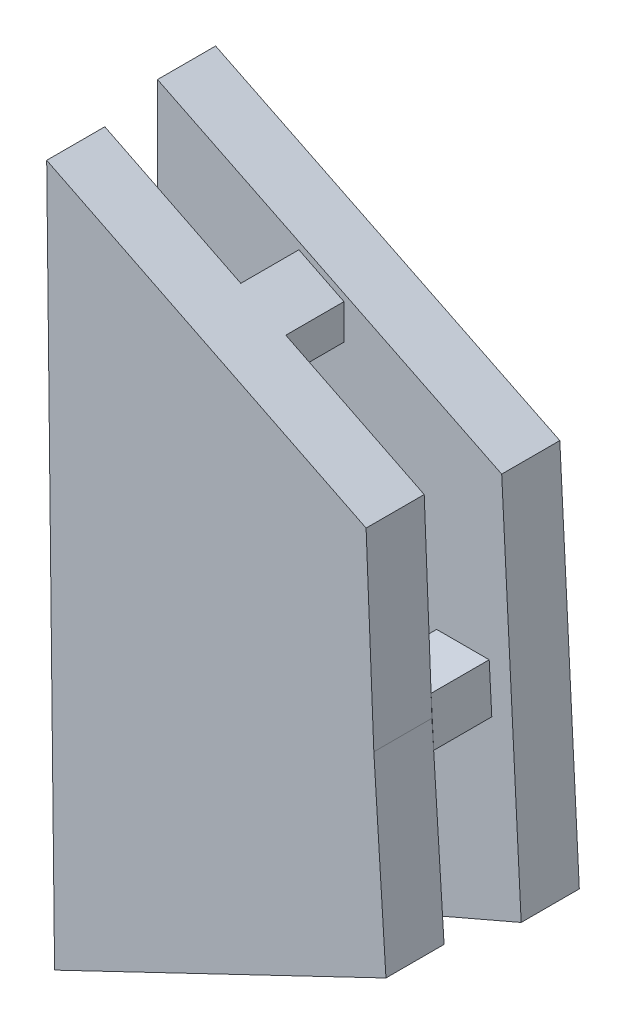
ISO-10303-21;
HEADER;
FILE_DESCRIPTION(('STEP AP214'),'2;1');
FILE_NAME('part.step','',(''),(''),'','','');
FILE_SCHEMA(('AUTOMOTIVE_DESIGN { 1 0 10303 214 1 1 1 1 }'));
ENDSEC;
DATA;
#1=APPLICATION_CONTEXT('core data for automotive mechanical design processes');
#2=APPLICATION_PROTOCOL_DEFINITION('international standard','automotive_design',2000,#1);
#3=PRODUCT_CONTEXT('',#1,'mechanical');
#4=PRODUCT('Part','Part','',(#3));
#5=PRODUCT_RELATED_PRODUCT_CATEGORY('part','',(#4));
#6=PRODUCT_DEFINITION_FORMATION('','',#4);
#7=PRODUCT_DEFINITION_CONTEXT('part definition',#1,'design');
#8=PRODUCT_DEFINITION('design','',#6,#7);
#9=PRODUCT_DEFINITION_SHAPE('','',#8);
#10=(LENGTH_UNIT() NAMED_UNIT(*) SI_UNIT(.MILLI.,.METRE.));
#11=(NAMED_UNIT(*) PLANE_ANGLE_UNIT() SI_UNIT($,.RADIAN.));
#12=(NAMED_UNIT(*) SI_UNIT($,.STERADIAN.) SOLID_ANGLE_UNIT());
#13=UNCERTAINTY_MEASURE_WITH_UNIT(LENGTH_MEASURE(1.E-05),#10,'distance_accuracy_value','');
#14=(GEOMETRIC_REPRESENTATION_CONTEXT(3) GLOBAL_UNCERTAINTY_ASSIGNED_CONTEXT((#13)) GLOBAL_UNIT_ASSIGNED_CONTEXT((#10,
#11,#12)) REPRESENTATION_CONTEXT('',''));
#15=CARTESIAN_POINT('',(0.,0.,0.));
#16=DIRECTION('',(0.,0.,1.));
#17=DIRECTION('',(1.,0.,0.));
#18=AXIS2_PLACEMENT_3D('',#15,#16,#17);
#19=CARTESIAN_POINT('',(0.,0.,0.));
#20=DIRECTION('',(0.,0.,1.));
#21=DIRECTION('',(1.,0.,0.));
#22=AXIS2_PLACEMENT_3D('',#19,#20,#21);
#23=PLANE('',#22);
#24=DIRECTION('',(0.,-1.,0.));
#25=VECTOR('',#24,1.);
#26=CARTESIAN_POINT('',(28.3580590298271,93.9456798736849,0.));
#27=LINE('',#26,#25);
#28=CARTESIAN_POINT('',(28.3580590298271,93.9456798736849,0.));
#29=VERTEX_POINT('',#28);
#30=CARTESIAN_POINT('',(28.3580590298271,87.9037118286448,0.));
#31=VERTEX_POINT('',#30);
#32=EDGE_CURVE('E237',#29,#31,#27,.T.);
#33=ORIENTED_EDGE('',*,*,#32,.F.);
#34=DIRECTION('',(-0.895431634760368,0.445199042530838,0.));
#35=VECTOR('',#34,1.);
#36=CARTESIAN_POINT('',(52.1695067214978,82.1068824690769,0.));
#37=LINE('',#36,#35);
#38=CARTESIAN_POINT('',(52.1695067214978,82.1068824690769,0.));
#39=VERTEX_POINT('',#38);
#40=EDGE_CURVE('E379',#39,#29,#37,.T.);
#41=ORIENTED_EDGE('',*,*,#40,.F.);
#42=DIRECTION('',(-0.0407260056603729,0.999170352073635,0.));
#43=VECTOR('',#42,1.);
#44=CARTESIAN_POINT('',(53.5013215048252,49.4321866727013,0.));
#45=LINE('',#44,#43);
#46=CARTESIAN_POINT('',(53.3528118802591,53.0757164384612,0.));
#47=VERTEX_POINT('',#46);
#48=EDGE_CURVE('E392',#47,#39,#45,.T.);
#49=ORIENTED_EDGE('',*,*,#48,.F.);
#50=DIRECTION('',(1.,0.,0.));
#51=VECTOR('',#50,1.);
#52=CARTESIAN_POINT('',(53.3528118802591,53.0757164384612,0.));
#53=LINE('',#52,#51);
#54=CARTESIAN_POINT('',(44.3058134388146,53.0757164384612,0.));
#55=VERTEX_POINT('',#54);
#56=EDGE_CURVE('E300',#55,#47,#53,.T.);
#57=ORIENTED_EDGE('',*,*,#56,.F.);
#58=DIRECTION('',(0.,1.,0.));
#59=VECTOR('',#58,1.);
#60=CARTESIAN_POINT('',(44.3058134388146,53.0757164384612,0.));
#61=LINE('',#60,#59);
#62=CARTESIAN_POINT('',(44.3058134388146,44.7938339923297,0.));
#63=VERTEX_POINT('',#62);
#64=EDGE_CURVE('E314',#63,#55,#61,.T.);
#65=ORIENTED_EDGE('',*,*,#64,.F.);
#66=DIRECTION('',(-1.,0.,0.));
#67=VECTOR('',#66,1.);
#68=CARTESIAN_POINT('',(44.3058134388146,44.7938339923297,0.));
#69=LINE('',#68,#67);
#70=CARTESIAN_POINT('',(53.7973998047266,44.7938339923297,0.));
#71=VERTEX_POINT('',#70);
#72=EDGE_CURVE('E312',#71,#63,#69,.T.);
#73=ORIENTED_EDGE('',*,*,#72,.F.);
#74=DIRECTION('',(-0.0637029903007709,0.997968901833489,0.));
#75=VECTOR('',#74,1.);
#76=CARTESIAN_POINT('',(53.5013215048252,49.4321866727013,0.));
#77=LINE('',#76,#75);
#78=CARTESIAN_POINT('',(55.5864086158522,16.767282174591,0.));
#79=VERTEX_POINT('',#78);
#80=EDGE_CURVE('E389',#79,#71,#77,.T.);
#81=ORIENTED_EDGE('',*,*,#80,.F.);
#82=DIRECTION('',(0.901738459887488,0.432282025950352,0.));
#83=VECTOR('',#82,1.);
#84=CARTESIAN_POINT('',(-1.43448385489415,-10.5678133272987,0.));
#85=LINE('',#84,#83);
#86=CARTESIAN_POINT('',(28.3580590298271,3.71435536053458,0.));
#87=VERTEX_POINT('',#86);
#88=EDGE_CURVE('E386',#87,#79,#85,.T.);
#89=ORIENTED_EDGE('',*,*,#88,.F.);
#90=DIRECTION('',(0.,-1.,0.));
#91=VECTOR('',#90,1.);
#92=CARTESIAN_POINT('',(28.3580590298271,10.9396737784166,0.));
#93=LINE('',#92,#91);
#94=CARTESIAN_POINT('',(28.3580590298271,10.9396737784166,0.));
#95=VERTEX_POINT('',#94);
#96=EDGE_CURVE('E272',#95,#87,#93,.T.);
#97=ORIENTED_EDGE('',*,*,#96,.F.);
#98=DIRECTION('',(0.975258411483094,0.221067932616815,0.));
#99=VECTOR('',#98,1.);
#100=CARTESIAN_POINT('',(20.6099296114924,9.18335675311255,0.));
#101=LINE('',#100,#99);
#102=CARTESIAN_POINT('',(20.6099296114924,9.18335675311255,0.));
#103=VERTEX_POINT('',#102);
#104=EDGE_CURVE('E282',#103,#95,#101,.T.);
#105=ORIENTED_EDGE('',*,*,#104,.F.);
#106=DIRECTION('',(0.,1.,0.));
#107=VECTOR('',#106,1.);
#108=CARTESIAN_POINT('',(20.6099296114924,0.,0.));
#109=LINE('',#108,#107);
#110=CARTESIAN_POINT('',(20.6099296114924,0.,0.));
#111=VERTEX_POINT('',#110);
#112=EDGE_CURVE('E269',#111,#103,#109,.T.);
#113=ORIENTED_EDGE('',*,*,#112,.F.);
#114=CARTESIAN_POINT('',(-1.43448385489415,-10.5678133272987,0.));
#115=VERTEX_POINT('',#114);
#116=EDGE_CURVE('E387',#115,#111,#85,.T.);
#117=ORIENTED_EDGE('',*,*,#116,.F.);
#118=DIRECTION('',(0.0112956597950651,-0.999936201999805,0.));
#119=VECTOR('',#118,1.);
#120=CARTESIAN_POINT('',(-2.79004951268007,109.432186672701,0.));
#121=LINE('',#120,#119);
#122=CARTESIAN_POINT('',(-2.05987008710202,44.7938339923297,0.));
#123=VERTEX_POINT('',#122);
#124=EDGE_CURVE('E382',#123,#115,#121,.T.);
#125=ORIENTED_EDGE('',*,*,#124,.F.);
#126=DIRECTION('',(-1.,0.,0.));
#127=VECTOR('',#126,1.);
#128=CARTESIAN_POINT('',(6.50402066704636,44.7938339923297,0.));
#129=LINE('',#128,#127);
#130=CARTESIAN_POINT('',(6.50402066704636,44.7938339923297,0.));
#131=VERTEX_POINT('',#130);
#132=EDGE_CURVE('E337',#131,#123,#129,.T.);
#133=ORIENTED_EDGE('',*,*,#132,.F.);
#134=DIRECTION('',(0.,-1.,0.));
#135=VECTOR('',#134,1.);
#136=CARTESIAN_POINT('',(6.50402066704636,53.0757164384612,0.));
#137=LINE('',#136,#135);
#138=CARTESIAN_POINT('',(6.50402066704636,53.0757164384612,0.));
#139=VERTEX_POINT('',#138);
#140=EDGE_CURVE('E349',#139,#131,#137,.T.);
#141=ORIENTED_EDGE('',*,*,#140,.F.);
#142=DIRECTION('',(1.,0.,0.));
#143=VECTOR('',#142,1.);
#144=CARTESIAN_POINT('',(-2.15342538231698,53.0757164384612,0.));
#145=LINE('',#144,#143);
#146=CARTESIAN_POINT('',(-2.15342538231698,53.0757164384612,0.));
#147=VERTEX_POINT('',#146);
#148=EDGE_CURVE('E332',#147,#139,#145,.T.);
#149=ORIENTED_EDGE('',*,*,#148,.F.);
#150=CARTESIAN_POINT('',(-2.79004951268007,109.432186672701,0.));
#151=VERTEX_POINT('',#150);
#152=EDGE_CURVE('E383',#151,#147,#121,.T.);
#153=ORIENTED_EDGE('',*,*,#152,.F.);
#154=CARTESIAN_POINT('',(20.6099296114924,97.797967043962,0.));
#155=VERTEX_POINT('',#154);
#156=EDGE_CURVE('E365',#155,#151,#37,.T.);
#157=ORIENTED_EDGE('',*,*,#156,.F.);
#158=DIRECTION('',(0.,1.,0.));
#159=VECTOR('',#158,1.);
#160=CARTESIAN_POINT('',(20.6099296114924,87.9037118286448,0.));
#161=LINE('',#160,#159);
#162=CARTESIAN_POINT('',(20.6099296114924,87.9037118286448,0.));
#163=VERTEX_POINT('',#162);
#164=EDGE_CURVE('E249',#163,#155,#161,.T.);
#165=ORIENTED_EDGE('',*,*,#164,.F.);
#166=DIRECTION('',(-1.,0.,0.));
#167=VECTOR('',#166,1.);
#168=CARTESIAN_POINT('',(28.3580590298271,87.9037118286448,0.));
#169=LINE('',#168,#167);
#170=EDGE_CURVE('E239',#31,#163,#169,.T.);
#171=ORIENTED_EDGE('',*,*,#170,.F.);
#172=EDGE_LOOP('',(#33,#41,#49,#57,#65,#73,#81,#89,#97,#105,#113,#117,#125,#133,#141,#149,#153,
#157,#165,#171));
#173=FACE_BOUND('',#172,.T.);
#174=ADVANCED_FACE('F33',(#173),#23,.F.);
#175=CARTESIAN_POINT('',(52.1695067214978,82.1068824690769,10.));
#176=DIRECTION('',(-0.445199042530838,-0.895431634760368,0.));
#177=DIRECTION('',(0.895431634760368,-0.445199042530838,0.));
#178=AXIS2_PLACEMENT_3D('',#175,#176,#177);
#179=PLANE('',#178);
#180=ORIENTED_EDGE('',*,*,#40,.T.);
#181=DIRECTION('',(0.,0.,1.));
#182=VECTOR('',#181,1.);
#183=CARTESIAN_POINT('',(28.3580590298271,93.9456798736849,-10.));
#184=LINE('',#183,#182);
#185=CARTESIAN_POINT('',(28.3580590298271,93.9456798736849,-10.));
#186=VERTEX_POINT('',#185);
#187=EDGE_CURVE('E267',#186,#29,#184,.T.);
#188=ORIENTED_EDGE('',*,*,#187,.F.);
#189=DIRECTION('',(0.895431634760368,-0.445199042530839,0.));
#190=VECTOR('',#189,1.);
#191=CARTESIAN_POINT('',(20.6099296114924,97.797967043962,-10.));
#192=LINE('',#191,#190);
#193=CARTESIAN_POINT('',(20.6099296114924,97.797967043962,-10.));
#194=VERTEX_POINT('',#193);
#195=EDGE_CURVE('E245',#194,#186,#192,.T.);
#196=ORIENTED_EDGE('',*,*,#195,.F.);
#197=DIRECTION('',(0.,0.,1.));
#198=VECTOR('',#197,1.);
#199=CARTESIAN_POINT('',(20.6099296114924,97.797967043962,-10.));
#200=LINE('',#199,#198);
#201=EDGE_CURVE('E56',#194,#155,#200,.T.);
#202=ORIENTED_EDGE('',*,*,#201,.T.);
#203=ORIENTED_EDGE('',*,*,#156,.T.);
#204=DIRECTION('',(0.,0.,-1.));
#205=VECTOR('',#204,1.);
#206=CARTESIAN_POINT('',(-2.79004951268007,109.432186672701,10.));
#207=LINE('',#206,#205);
#208=CARTESIAN_POINT('',(-2.79004951268007,109.432186672701,10.));
#209=VERTEX_POINT('',#208);
#210=EDGE_CURVE('E11',#209,#151,#207,.T.);
#211=ORIENTED_EDGE('',*,*,#210,.F.);
#212=DIRECTION('',(-0.895431634760368,0.445199042530838,0.));
#213=VECTOR('',#212,1.);
#214=CARTESIAN_POINT('',(52.1695067214978,82.1068824690769,10.));
#215=LINE('',#214,#213);
#216=CARTESIAN_POINT('',(52.1695067214978,82.1068824690769,10.));
#217=VERTEX_POINT('',#216);
#218=EDGE_CURVE('E366',#217,#209,#215,.T.);
#219=ORIENTED_EDGE('',*,*,#218,.F.);
#220=DIRECTION('',(0.,0.,-1.));
#221=VECTOR('',#220,1.);
#222=CARTESIAN_POINT('',(52.1695067214978,82.1068824690769,10.));
#223=LINE('',#222,#221);
#224=EDGE_CURVE('E378',#217,#39,#223,.T.);
#225=ORIENTED_EDGE('',*,*,#224,.T.);
#226=EDGE_LOOP('',(#180,#188,#196,#202,#203,#211,#219,#225));
#227=FACE_BOUND('',#226,.T.);
#228=ADVANCED_FACE('F35',(#227),#179,.F.);
#229=CARTESIAN_POINT('',(-2.79004951268007,109.432186672701,10.));
#230=DIRECTION('',(0.999936201999805,0.0112956597950651,0.));
#231=DIRECTION('',(-0.0112956597950651,0.999936201999805,0.));
#232=AXIS2_PLACEMENT_3D('',#229,#230,#231);
#233=PLANE('',#232);
#234=ORIENTED_EDGE('',*,*,#152,.T.);
#235=DIRECTION('',(0.,0.,1.));
#236=VECTOR('',#235,1.);
#237=CARTESIAN_POINT('',(-2.15342538231698,53.0757164384612,-10.));
#238=LINE('',#237,#236);
#239=CARTESIAN_POINT('',(-2.15342538231698,53.0757164384612,-10.));
#240=VERTEX_POINT('',#239);
#241=EDGE_CURVE('E362',#240,#147,#238,.T.);
#242=ORIENTED_EDGE('',*,*,#241,.F.);
#243=DIRECTION('',(-0.0112956597950653,0.999936201999804,0.));
#244=VECTOR('',#243,1.);
#245=CARTESIAN_POINT('',(-2.05987008710202,44.7938339923297,-10.));
#246=LINE('',#245,#244);
#247=CARTESIAN_POINT('',(-2.05987008710202,44.7938339923297,-10.));
#248=VERTEX_POINT('',#247);
#249=EDGE_CURVE('E333',#248,#240,#246,.T.);
#250=ORIENTED_EDGE('',*,*,#249,.F.);
#251=DIRECTION('',(0.,0.,1.));
#252=VECTOR('',#251,1.);
#253=CARTESIAN_POINT('',(-2.05987008710202,44.7938339923297,-10.));
#254=LINE('',#253,#252);
#255=EDGE_CURVE('E346',#248,#123,#254,.T.);
#256=ORIENTED_EDGE('',*,*,#255,.T.);
#257=ORIENTED_EDGE('',*,*,#124,.T.);
#258=DIRECTION('',(0.,0.,-1.));
#259=VECTOR('',#258,1.);
#260=CARTESIAN_POINT('',(-1.43448385489415,-10.5678133272987,10.));
#261=LINE('',#260,#259);
#262=CARTESIAN_POINT('',(-1.43448385489415,-10.5678133272987,10.));
#263=VERTEX_POINT('',#262);
#264=EDGE_CURVE('E41',#263,#115,#261,.T.);
#265=ORIENTED_EDGE('',*,*,#264,.F.);
#266=DIRECTION('',(0.0112956597950651,-0.999936201999805,0.));
#267=VECTOR('',#266,1.);
#268=CARTESIAN_POINT('',(-2.79004951268007,109.432186672701,10.));
#269=LINE('',#268,#267);
#270=EDGE_CURVE('E369',#209,#263,#269,.T.);
#271=ORIENTED_EDGE('',*,*,#270,.F.);
#272=ORIENTED_EDGE('',*,*,#210,.T.);
#273=EDGE_LOOP('',(#234,#242,#250,#256,#257,#265,#271,#272));
#274=FACE_BOUND('',#273,.T.);
#275=ADVANCED_FACE('F478',(#274),#233,.F.);
#276=CARTESIAN_POINT('',(-1.43448385489415,-10.5678133272987,10.));
#277=DIRECTION('',(-0.432282025950352,0.901738459887488,0.));
#278=DIRECTION('',(-0.901738459887488,-0.432282025950352,0.));
#279=AXIS2_PLACEMENT_3D('',#276,#277,#278);
#280=PLANE('',#279);
#281=ORIENTED_EDGE('',*,*,#116,.T.);
#282=DIRECTION('',(0.,0.,1.));
#283=VECTOR('',#282,1.);
#284=CARTESIAN_POINT('',(20.6099296114924,0.,-10.));
#285=LINE('',#284,#283);
#286=CARTESIAN_POINT('',(20.6099296114924,0.,-10.));
#287=VERTEX_POINT('',#286);
#288=EDGE_CURVE('E293',#287,#111,#285,.T.);
#289=ORIENTED_EDGE('',*,*,#288,.F.);
#290=DIRECTION('',(-0.901738459887488,-0.432282025950353,0.));
#291=VECTOR('',#290,1.);
#292=CARTESIAN_POINT('',(24.4839943206598,1.85717768026729,-10.));
#293=LINE('',#292,#291);
#294=CARTESIAN_POINT('',(-2.70718247574448,-11.1779289680512,-10.));
#295=VERTEX_POINT('',#294);
#296=EDGE_CURVE('E423',#287,#295,#293,.T.);
#297=ORIENTED_EDGE('',*,*,#296,.T.);
#298=DIRECTION('',(0.,0.,1.));
#299=VECTOR('',#298,1.);
#300=CARTESIAN_POINT('',(-2.70718247574448,-11.1779289680512,-20.));
#301=LINE('',#300,#299);
#302=CARTESIAN_POINT('',(-2.70718247574448,-11.1779289680512,-20.));
#303=VERTEX_POINT('',#302);
#304=EDGE_CURVE('E220',#303,#295,#301,.T.);
#305=ORIENTED_EDGE('',*,*,#304,.F.);
#306=DIRECTION('',(-0.901738459887488,-0.432282025950353,0.));
#307=VECTOR('',#306,1.);
#308=CARTESIAN_POINT('',(24.4839943206598,1.85717768026729,-20.));
#309=LINE('',#308,#307);
#310=CARTESIAN_POINT('',(24.4839943206598,1.85717768026729,-20.));
#311=VERTEX_POINT('',#310);
#312=EDGE_CURVE('E212',#311,#303,#309,.T.);
#313=ORIENTED_EDGE('',*,*,#312,.F.);
#314=DIRECTION('',(0.,0.,1.));
#315=VECTOR('',#314,1.);
#316=CARTESIAN_POINT('',(24.4839943206598,1.85717768026729,-20.));
#317=LINE('',#316,#315);
#318=CARTESIAN_POINT('',(24.4839943206582,1.85717768026659,-10.));
#319=VERTEX_POINT('',#318);
#320=EDGE_CURVE('E217',#311,#319,#317,.T.);
#321=ORIENTED_EDGE('',*,*,#320,.T.);
#322=DIRECTION('',(-0.901738459887488,-0.432282025950353,0.));
#323=VECTOR('',#322,1.);
#324=CARTESIAN_POINT('',(28.3580590298271,3.71435536053458,-10.));
#325=LINE('',#324,#323);
#326=CARTESIAN_POINT('',(28.3580590298271,3.71435536053458,-10.));
#327=VERTEX_POINT('',#326);
#328=EDGE_CURVE('E48',#327,#319,#325,.T.);
#329=ORIENTED_EDGE('',*,*,#328,.F.);
#330=DIRECTION('',(0.,0.,1.));
#331=VECTOR('',#330,1.);
#332=CARTESIAN_POINT('',(28.3580590298271,3.71435536053458,-10.));
#333=LINE('',#332,#331);
#334=EDGE_CURVE('E280',#327,#87,#333,.T.);
#335=ORIENTED_EDGE('',*,*,#334,.T.);
#336=ORIENTED_EDGE('',*,*,#88,.T.);
#337=DIRECTION('',(0.,0.,-1.));
#338=VECTOR('',#337,1.);
#339=CARTESIAN_POINT('',(55.5864086158522,16.767282174591,10.));
#340=LINE('',#339,#338);
#341=CARTESIAN_POINT('',(55.5864086158522,16.767282174591,10.));
#342=VERTEX_POINT('',#341);
#343=EDGE_CURVE('E400',#342,#79,#340,.T.);
#344=ORIENTED_EDGE('',*,*,#343,.F.);
#345=DIRECTION('',(0.901738459887488,0.432282025950352,0.));
#346=VECTOR('',#345,1.);
#347=CARTESIAN_POINT('',(-1.43448385489415,-10.5678133272987,10.));
#348=LINE('',#347,#346);
#349=EDGE_CURVE('E372',#263,#342,#348,.T.);
#350=ORIENTED_EDGE('',*,*,#349,.F.);
#351=ORIENTED_EDGE('',*,*,#264,.T.);
#352=EDGE_LOOP('',(#281,#289,#297,#305,#313,#321,#329,#335,#336,#344,#350,#351));
#353=FACE_BOUND('',#352,.T.);
#354=ADVANCED_FACE('F215',(#353),#280,.F.);
#355=CARTESIAN_POINT('',(53.5013215048252,49.4321866727013,10.));
#356=DIRECTION('',(-0.997968901833489,-0.0637029903007709,0.));
#357=DIRECTION('',(0.0637029903007709,-0.997968901833489,0.));
#358=AXIS2_PLACEMENT_3D('',#355,#356,#357);
#359=PLANE('',#358);
#360=ORIENTED_EDGE('',*,*,#80,.T.);
#361=DIRECTION('',(-0.0637029903007709,0.997968901833489,0.));
#362=VECTOR('',#361,1.);
#363=CARTESIAN_POINT('',(53.5013215048252,49.4321866727013,0.));
#364=LINE('',#363,#362);
#365=CARTESIAN_POINT('',(53.5013215048252,49.4321866727013,0.));
#366=VERTEX_POINT('',#365);
#367=EDGE_CURVE('E329',#71,#366,#364,.T.);
#368=ORIENTED_EDGE('',*,*,#367,.T.);
#369=DIRECTION('',(0.,0.,-1.));
#370=VECTOR('',#369,1.);
#371=CARTESIAN_POINT('',(53.5013215048252,49.4321866727013,10.));
#372=LINE('',#371,#370);
#373=CARTESIAN_POINT('',(53.5013215048252,49.4321866727013,10.));
#374=VERTEX_POINT('',#373);
#375=EDGE_CURVE('E397',#374,#366,#372,.T.);
#376=ORIENTED_EDGE('',*,*,#375,.F.);
#377=DIRECTION('',(-0.0637029903007709,0.997968901833489,0.));
#378=VECTOR('',#377,1.);
#379=CARTESIAN_POINT('',(53.5013215048252,49.4321866727013,10.));
#380=LINE('',#379,#378);
#381=EDGE_CURVE('E374',#342,#374,#380,.T.);
#382=ORIENTED_EDGE('',*,*,#381,.F.);
#383=ORIENTED_EDGE('',*,*,#343,.T.);
#384=EDGE_LOOP('',(#360,#368,#376,#382,#383));
#385=FACE_BOUND('',#384,.T.);
#386=ADVANCED_FACE('F486',(#385),#359,.F.);
#387=CARTESIAN_POINT('',(53.5013215048252,49.4321866727013,10.));
#388=DIRECTION('',(-0.999170352073635,-0.0407260056603729,0.));
#389=DIRECTION('',(0.0407260056603729,-0.999170352073635,0.));
#390=AXIS2_PLACEMENT_3D('',#387,#388,#389);
#391=PLANE('',#390);
#392=EDGE_CURVE('E370',#366,#47,#45,.T.);
#393=ORIENTED_EDGE('',*,*,#392,.T.);
#394=ORIENTED_EDGE('',*,*,#48,.T.);
#395=ORIENTED_EDGE('',*,*,#224,.F.);
#396=DIRECTION('',(-0.0407260056603729,0.999170352073635,0.));
#397=VECTOR('',#396,1.);
#398=CARTESIAN_POINT('',(53.5013215048252,49.4321866727013,10.));
#399=LINE('',#398,#397);
#400=EDGE_CURVE('E376',#374,#217,#399,.T.);
#401=ORIENTED_EDGE('',*,*,#400,.F.);
#402=ORIENTED_EDGE('',*,*,#375,.T.);
#403=EDGE_LOOP('',(#393,#394,#395,#401,#402));
#404=FACE_BOUND('',#403,.T.);
#405=ADVANCED_FACE('F483',(#404),#391,.F.);
#406=CARTESIAN_POINT('',(0.,0.,10.));
#407=DIRECTION('',(0.,0.,1.));
#408=DIRECTION('',(1.,0.,0.));
#409=AXIS2_PLACEMENT_3D('',#406,#407,#408);
#410=PLANE('',#409);
#411=ORIENTED_EDGE('',*,*,#218,.T.);
#412=ORIENTED_EDGE('',*,*,#270,.T.);
#413=ORIENTED_EDGE('',*,*,#349,.T.);
#414=ORIENTED_EDGE('',*,*,#381,.T.);
#415=ORIENTED_EDGE('',*,*,#400,.T.);
#416=EDGE_LOOP('',(#411,#412,#413,#414,#415));
#417=FACE_BOUND('',#416,.T.);
#418=ADVANCED_FACE('F481',(#417),#410,.T.);
#419=CARTESIAN_POINT('',(-2.15342538231698,53.0757164384612,-10.));
#420=DIRECTION('',(0.,-1.,0.));
#421=DIRECTION('',(0.,0.,-1.));
#422=AXIS2_PLACEMENT_3D('',#419,#420,#421);
#423=PLANE('',#422);
#424=ORIENTED_EDGE('',*,*,#148,.T.);
#425=DIRECTION('',(0.,0.,1.));
#426=VECTOR('',#425,1.);
#427=CARTESIAN_POINT('',(6.50402066704636,53.0757164384612,-10.));
#428=LINE('',#427,#426);
#429=CARTESIAN_POINT('',(6.50402066704636,53.0757164384612,-10.));
#430=VERTEX_POINT('',#429);
#431=EDGE_CURVE('E359',#430,#139,#428,.T.);
#432=ORIENTED_EDGE('',*,*,#431,.F.);
#433=DIRECTION('',(1.,0.,0.));
#434=VECTOR('',#433,1.);
#435=CARTESIAN_POINT('',(-2.15342538231698,53.0757164384612,-10.));
#436=LINE('',#435,#434);
#437=EDGE_CURVE('E336',#240,#430,#436,.T.);
#438=ORIENTED_EDGE('',*,*,#437,.F.);
#439=ORIENTED_EDGE('',*,*,#241,.T.);
#440=EDGE_LOOP('',(#424,#432,#438,#439));
#441=FACE_BOUND('',#440,.T.);
#442=ADVANCED_FACE('F500',(#441),#423,.F.);
#443=CARTESIAN_POINT('',(6.50402066704636,53.0757164384612,-10.));
#444=DIRECTION('',(-1.,0.,0.));
#445=DIRECTION('',(0.,0.,1.));
#446=AXIS2_PLACEMENT_3D('',#443,#444,#445);
#447=PLANE('',#446);
#448=ORIENTED_EDGE('',*,*,#140,.T.);
#449=DIRECTION('',(0.,0.,1.));
#450=VECTOR('',#449,1.);
#451=CARTESIAN_POINT('',(6.50402066704636,44.7938339923297,-10.));
#452=LINE('',#451,#450);
#453=CARTESIAN_POINT('',(6.50402066704636,44.7938339923297,-10.));
#454=VERTEX_POINT('',#453);
#455=EDGE_CURVE('E356',#454,#131,#452,.T.);
#456=ORIENTED_EDGE('',*,*,#455,.F.);
#457=DIRECTION('',(0.,-1.,0.));
#458=VECTOR('',#457,1.);
#459=CARTESIAN_POINT('',(6.50402066704636,53.0757164384612,-10.));
#460=LINE('',#459,#458);
#461=EDGE_CURVE('E340',#430,#454,#460,.T.);
#462=ORIENTED_EDGE('',*,*,#461,.F.);
#463=ORIENTED_EDGE('',*,*,#431,.T.);
#464=EDGE_LOOP('',(#448,#456,#462,#463));
#465=FACE_BOUND('',#464,.T.);
#466=ADVANCED_FACE('F509',(#465),#447,.F.);
#467=CARTESIAN_POINT('',(6.50402066704636,44.7938339923297,-10.));
#468=DIRECTION('',(0.,1.,0.));
#469=DIRECTION('',(-1.,0.,0.));
#470=AXIS2_PLACEMENT_3D('',#467,#468,#469);
#471=PLANE('',#470);
#472=ORIENTED_EDGE('',*,*,#132,.T.);
#473=ORIENTED_EDGE('',*,*,#255,.F.);
#474=DIRECTION('',(-1.,0.,0.));
#475=VECTOR('',#474,1.);
#476=CARTESIAN_POINT('',(6.50402066704636,44.7938339923297,-10.));
#477=LINE('',#476,#475);
#478=EDGE_CURVE('E343',#454,#248,#477,.T.);
#479=ORIENTED_EDGE('',*,*,#478,.F.);
#480=ORIENTED_EDGE('',*,*,#455,.T.);
#481=EDGE_LOOP('',(#472,#473,#479,#480));
#482=FACE_BOUND('',#481,.T.);
#483=ADVANCED_FACE('F507',(#482),#471,.F.);
#484=CARTESIAN_POINT('',(0.,0.,0.));
#485=DIRECTION('',(0.,0.,1.));
#486=DIRECTION('',(1.,0.,0.));
#487=AXIS2_PLACEMENT_3D('',#484,#485,#486);
#488=PLANE('',#487);
#489=ORIENTED_EDGE('',*,*,#367,.F.);
#490=DIRECTION('',(0.0536048068321216,-0.998562228749161,0.));
#491=VECTOR('',#490,1.);
#492=CARTESIAN_POINT('',(53.7973998047266,44.7938339923297,0.));
#493=LINE('',#492,#491);
#494=EDGE_CURVE('E295',#47,#71,#493,.T.);
#495=ORIENTED_EDGE('',*,*,#494,.F.);
#496=ORIENTED_EDGE('',*,*,#392,.F.);
#497=EDGE_LOOP('',(#489,#495,#496));
#498=FACE_BOUND('',#497,.T.);
#499=ADVANCED_FACE('F516',(#498),#488,.T.);
#500=CARTESIAN_POINT('',(53.7973998047266,44.7938339923297,-10.));
#501=DIRECTION('',(-0.998562228749161,-0.0536048068321216,0.));
#502=DIRECTION('',(0.0536048068321216,-0.998562228749161,0.));
#503=AXIS2_PLACEMENT_3D('',#500,#501,#502);
#504=PLANE('',#503);
#505=ORIENTED_EDGE('',*,*,#494,.T.);
#506=DIRECTION('',(0.,0.,1.));
#507=VECTOR('',#506,1.);
#508=CARTESIAN_POINT('',(53.7973998047266,44.7938339923297,-10.));
#509=LINE('',#508,#507);
#510=CARTESIAN_POINT('',(53.7973998047266,44.7938339923297,-10.));
#511=VERTEX_POINT('',#510);
#512=EDGE_CURVE('E326',#511,#71,#509,.T.);
#513=ORIENTED_EDGE('',*,*,#512,.F.);
#514=DIRECTION('',(0.0536048068321216,-0.998562228749161,0.));
#515=VECTOR('',#514,1.);
#516=CARTESIAN_POINT('',(53.7973998047266,44.7938339923297,-10.));
#517=LINE('',#516,#515);
#518=CARTESIAN_POINT('',(53.3528118802591,53.0757164384612,-10.));
#519=VERTEX_POINT('',#518);
#520=EDGE_CURVE('E296',#519,#511,#517,.T.);
#521=ORIENTED_EDGE('',*,*,#520,.F.);
#522=DIRECTION('',(0.,0.,1.));
#523=VECTOR('',#522,1.);
#524=CARTESIAN_POINT('',(53.3528118802591,53.0757164384612,-10.));
#525=LINE('',#524,#523);
#526=EDGE_CURVE('E309',#519,#47,#525,.T.);
#527=ORIENTED_EDGE('',*,*,#526,.T.);
#528=EDGE_LOOP('',(#505,#513,#521,#527));
#529=FACE_BOUND('',#528,.T.);
#530=ADVANCED_FACE('F519',(#529),#504,.F.);
#531=CARTESIAN_POINT('',(44.3058134388146,44.7938339923297,-10.));
#532=DIRECTION('',(0.,1.,0.));
#533=DIRECTION('',(0.,0.,1.));
#534=AXIS2_PLACEMENT_3D('',#531,#532,#533);
#535=PLANE('',#534);
#536=ORIENTED_EDGE('',*,*,#72,.T.);
#537=DIRECTION('',(0.,0.,1.));
#538=VECTOR('',#537,1.);
#539=CARTESIAN_POINT('',(44.3058134388146,44.7938339923297,-10.));
#540=LINE('',#539,#538);
#541=CARTESIAN_POINT('',(44.3058134388146,44.7938339923297,-10.));
#542=VERTEX_POINT('',#541);
#543=EDGE_CURVE('E323',#542,#63,#540,.T.);
#544=ORIENTED_EDGE('',*,*,#543,.F.);
#545=DIRECTION('',(-1.,0.,0.));
#546=VECTOR('',#545,1.);
#547=CARTESIAN_POINT('',(44.3058134388146,44.7938339923297,-10.));
#548=LINE('',#547,#546);
#549=EDGE_CURVE('E299',#511,#542,#548,.T.);
#550=ORIENTED_EDGE('',*,*,#549,.F.);
#551=ORIENTED_EDGE('',*,*,#512,.T.);
#552=EDGE_LOOP('',(#536,#544,#550,#551));
#553=FACE_BOUND('',#552,.T.);
#554=ADVANCED_FACE('F522',(#553),#535,.F.);
#555=CARTESIAN_POINT('',(44.3058134388146,53.0757164384612,-10.));
#556=DIRECTION('',(1.,0.,0.));
#557=DIRECTION('',(0.,0.,-1.));
#558=AXIS2_PLACEMENT_3D('',#555,#556,#557);
#559=PLANE('',#558);
#560=ORIENTED_EDGE('',*,*,#64,.T.);
#561=DIRECTION('',(0.,0.,1.));
#562=VECTOR('',#561,1.);
#563=CARTESIAN_POINT('',(44.3058134388146,53.0757164384612,-10.));
#564=LINE('',#563,#562);
#565=CARTESIAN_POINT('',(44.3058134388146,53.0757164384612,-10.));
#566=VERTEX_POINT('',#565);
#567=EDGE_CURVE('E320',#566,#55,#564,.T.);
#568=ORIENTED_EDGE('',*,*,#567,.F.);
#569=DIRECTION('',(0.,1.,0.));
#570=VECTOR('',#569,1.);
#571=CARTESIAN_POINT('',(44.3058134388146,53.0757164384612,-10.));
#572=LINE('',#571,#570);
#573=EDGE_CURVE('E303',#542,#566,#572,.T.);
#574=ORIENTED_EDGE('',*,*,#573,.F.);
#575=ORIENTED_EDGE('',*,*,#543,.T.);
#576=EDGE_LOOP('',(#560,#568,#574,#575));
#577=FACE_BOUND('',#576,.T.);
#578=ADVANCED_FACE('F526',(#577),#559,.F.);
#579=CARTESIAN_POINT('',(53.3528118802591,53.0757164384612,-10.));
#580=DIRECTION('',(0.,-1.,0.));
#581=DIRECTION('',(0.,0.,-1.));
#582=AXIS2_PLACEMENT_3D('',#579,#580,#581);
#583=PLANE('',#582);
#584=ORIENTED_EDGE('',*,*,#56,.T.);
#585=ORIENTED_EDGE('',*,*,#526,.F.);
#586=DIRECTION('',(1.,0.,0.));
#587=VECTOR('',#586,1.);
#588=CARTESIAN_POINT('',(53.3528118802591,53.0757164384612,-10.));
#589=LINE('',#588,#587);
#590=EDGE_CURVE('E306',#566,#519,#589,.T.);
#591=ORIENTED_EDGE('',*,*,#590,.F.);
#592=ORIENTED_EDGE('',*,*,#567,.T.);
#593=EDGE_LOOP('',(#584,#585,#591,#592));
#594=FACE_BOUND('',#593,.T.);
#595=ADVANCED_FACE('F530',(#594),#583,.F.);
#596=CARTESIAN_POINT('',(20.6099296114924,0.,-10.));
#597=DIRECTION('',(1.,0.,0.));
#598=DIRECTION('',(0.,0.,-1.));
#599=AXIS2_PLACEMENT_3D('',#596,#597,#598);
#600=PLANE('',#599);
#601=ORIENTED_EDGE('',*,*,#112,.T.);
#602=DIRECTION('',(0.,0.,1.));
#603=VECTOR('',#602,1.);
#604=CARTESIAN_POINT('',(20.6099296114924,9.18335675311255,-10.));
#605=LINE('',#604,#603);
#606=CARTESIAN_POINT('',(20.6099296114924,9.18335675311255,-10.));
#607=VERTEX_POINT('',#606);
#608=EDGE_CURVE('E290',#607,#103,#605,.T.);
#609=ORIENTED_EDGE('',*,*,#608,.F.);
#610=DIRECTION('',(0.,1.,0.));
#611=VECTOR('',#610,1.);
#612=CARTESIAN_POINT('',(20.6099296114924,0.,-10.));
#613=LINE('',#612,#611);
#614=EDGE_CURVE('E271',#287,#607,#613,.T.);
#615=ORIENTED_EDGE('',*,*,#614,.F.);
#616=ORIENTED_EDGE('',*,*,#288,.T.);
#617=EDGE_LOOP('',(#601,#609,#615,#616));
#618=FACE_BOUND('',#617,.T.);
#619=ADVANCED_FACE('F415',(#618),#600,.F.);
#620=CARTESIAN_POINT('',(20.6099296114924,9.18335675311255,-10.));
#621=DIRECTION('',(0.221067932616815,-0.975258411483094,0.));
#622=DIRECTION('',(0.975258411483094,0.221067932616815,0.));
#623=AXIS2_PLACEMENT_3D('',#620,#621,#622);
#624=PLANE('',#623);
#625=ORIENTED_EDGE('',*,*,#104,.T.);
#626=DIRECTION('',(0.,0.,1.));
#627=VECTOR('',#626,1.);
#628=CARTESIAN_POINT('',(28.3580590298271,10.9396737784166,-10.));
#629=LINE('',#628,#627);
#630=CARTESIAN_POINT('',(28.3580590298271,10.9396737784166,-10.));
#631=VERTEX_POINT('',#630);
#632=EDGE_CURVE('E287',#631,#95,#629,.T.);
#633=ORIENTED_EDGE('',*,*,#632,.F.);
#634=DIRECTION('',(0.975258411483094,0.221067932616815,0.));
#635=VECTOR('',#634,1.);
#636=CARTESIAN_POINT('',(20.6099296114924,9.18335675311255,-10.));
#637=LINE('',#636,#635);
#638=EDGE_CURVE('E275',#607,#631,#637,.T.);
#639=ORIENTED_EDGE('',*,*,#638,.F.);
#640=ORIENTED_EDGE('',*,*,#608,.T.);
#641=EDGE_LOOP('',(#625,#633,#639,#640));
#642=FACE_BOUND('',#641,.T.);
#643=ADVANCED_FACE('F418',(#642),#624,.F.);
#644=CARTESIAN_POINT('',(28.3580590298271,10.9396737784166,-10.));
#645=DIRECTION('',(-1.,0.,0.));
#646=DIRECTION('',(0.,-1.,0.));
#647=AXIS2_PLACEMENT_3D('',#644,#645,#646);
#648=PLANE('',#647);
#649=ORIENTED_EDGE('',*,*,#96,.T.);
#650=ORIENTED_EDGE('',*,*,#334,.F.);
#651=DIRECTION('',(0.,-1.,0.));
#652=VECTOR('',#651,1.);
#653=CARTESIAN_POINT('',(28.3580590298271,10.9396737784166,-10.));
#654=LINE('',#653,#652);
#655=EDGE_CURVE('E278',#631,#327,#654,.T.);
#656=ORIENTED_EDGE('',*,*,#655,.F.);
#657=ORIENTED_EDGE('',*,*,#632,.T.);
#658=EDGE_LOOP('',(#649,#650,#656,#657));
#659=FACE_BOUND('',#658,.T.);
#660=ADVANCED_FACE('F542',(#659),#648,.F.);
#661=CARTESIAN_POINT('',(28.3580590298271,93.9456798736849,-10.));
#662=DIRECTION('',(-1.,0.,0.));
#663=DIRECTION('',(0.,0.,1.));
#664=AXIS2_PLACEMENT_3D('',#661,#662,#663);
#665=PLANE('',#664);
#666=ORIENTED_EDGE('',*,*,#32,.T.);
#667=DIRECTION('',(0.,0.,1.));
#668=VECTOR('',#667,1.);
#669=CARTESIAN_POINT('',(28.3580590298271,87.9037118286448,-10.));
#670=LINE('',#669,#668);
#671=CARTESIAN_POINT('',(28.3580590298271,87.9037118286448,-10.));
#672=VERTEX_POINT('',#671);
#673=EDGE_CURVE('E264',#672,#31,#670,.T.);
#674=ORIENTED_EDGE('',*,*,#673,.F.);
#675=DIRECTION('',(0.,-1.,0.));
#676=VECTOR('',#675,1.);
#677=CARTESIAN_POINT('',(28.3580590298271,93.9456798736849,-10.));
#678=LINE('',#677,#676);
#679=EDGE_CURVE('E248',#186,#672,#678,.T.);
#680=ORIENTED_EDGE('',*,*,#679,.F.);
#681=ORIENTED_EDGE('',*,*,#187,.T.);
#682=EDGE_LOOP('',(#666,#674,#680,#681));
#683=FACE_BOUND('',#682,.T.);
#684=ADVANCED_FACE('F545',(#683),#665,.F.);
#685=CARTESIAN_POINT('',(28.3580590298271,87.9037118286448,-10.));
#686=DIRECTION('',(0.,1.,0.));
#687=DIRECTION('',(0.,0.,1.));
#688=AXIS2_PLACEMENT_3D('',#685,#686,#687);
#689=PLANE('',#688);
#690=ORIENTED_EDGE('',*,*,#170,.T.);
#691=DIRECTION('',(0.,0.,1.));
#692=VECTOR('',#691,1.);
#693=CARTESIAN_POINT('',(20.6099296114924,87.9037118286448,-10.));
#694=LINE('',#693,#692);
#695=CARTESIAN_POINT('',(20.6099296114924,87.9037118286448,-10.));
#696=VERTEX_POINT('',#695);
#697=EDGE_CURVE('E261',#696,#163,#694,.T.);
#698=ORIENTED_EDGE('',*,*,#697,.F.);
#699=DIRECTION('',(-1.,0.,0.));
#700=VECTOR('',#699,1.);
#701=CARTESIAN_POINT('',(28.3580590298271,87.9037118286448,-10.));
#702=LINE('',#701,#700);
#703=EDGE_CURVE('E252',#672,#696,#702,.T.);
#704=ORIENTED_EDGE('',*,*,#703,.F.);
#705=ORIENTED_EDGE('',*,*,#673,.T.);
#706=EDGE_LOOP('',(#690,#698,#704,#705));
#707=FACE_BOUND('',#706,.T.);
#708=ADVANCED_FACE('F549',(#707),#689,.F.);
#709=CARTESIAN_POINT('',(20.6099296114924,87.9037118286448,-10.));
#710=DIRECTION('',(1.,0.,0.));
#711=DIRECTION('',(0.,1.,0.));
#712=AXIS2_PLACEMENT_3D('',#709,#710,#711);
#713=PLANE('',#712);
#714=ORIENTED_EDGE('',*,*,#164,.T.);
#715=ORIENTED_EDGE('',*,*,#201,.F.);
#716=DIRECTION('',(0.,1.,0.));
#717=VECTOR('',#716,1.);
#718=CARTESIAN_POINT('',(20.6099296114924,87.9037118286448,-10.));
#719=LINE('',#718,#717);
#720=EDGE_CURVE('E255',#696,#194,#719,.T.);
#721=ORIENTED_EDGE('',*,*,#720,.F.);
#722=ORIENTED_EDGE('',*,*,#697,.T.);
#723=EDGE_LOOP('',(#714,#715,#721,#722));
#724=FACE_BOUND('',#723,.T.);
#725=ADVANCED_FACE('F553',(#724),#713,.F.);
#726=CARTESIAN_POINT('',(58.8563127160739,16.6771855244647,-20.));
#727=DIRECTION('',(-0.39592742612038,0.918281804919215,0.));
#728=DIRECTION('',(-0.918281804919215,-0.39592742612038,0.));
#729=AXIS2_PLACEMENT_3D('',#726,#727,#728);
#730=PLANE('',#729);
#731=DIRECTION('',(-0.918281804919215,-0.39592742612038,0.));
#732=VECTOR('',#731,1.);
#733=CARTESIAN_POINT('',(58.8563127160739,16.6771855244647,-10.));
#734=LINE('',#733,#732);
#735=CARTESIAN_POINT('',(58.8563127160739,16.6771855244647,-10.));
#736=VERTEX_POINT('',#735);
#737=EDGE_CURVE('E236',#736,#319,#734,.T.);
#738=ORIENTED_EDGE('',*,*,#737,.T.);
#739=ORIENTED_EDGE('',*,*,#320,.F.);
#740=DIRECTION('',(-0.918281804919215,-0.39592742612038,0.));
#741=VECTOR('',#740,1.);
#742=CARTESIAN_POINT('',(58.8563127160739,16.6771855244647,-20.));
#743=LINE('',#742,#741);
#744=CARTESIAN_POINT('',(58.8563127160739,16.6771855244647,-20.));
#745=VERTEX_POINT('',#744);
#746=EDGE_CURVE('E224',#745,#311,#743,.T.);
#747=ORIENTED_EDGE('',*,*,#746,.F.);
#748=DIRECTION('',(0.,0.,1.));
#749=VECTOR('',#748,1.);
#750=CARTESIAN_POINT('',(58.8563127160739,16.6771855244647,-20.));
#751=LINE('',#750,#749);
#752=EDGE_CURVE('E440',#745,#736,#751,.T.);
#753=ORIENTED_EDGE('',*,*,#752,.T.);
#754=EDGE_LOOP('',(#738,#739,#747,#753));
#755=FACE_BOUND('',#754,.T.);
#756=ADVANCED_FACE('F235',(#755),#730,.F.);
#757=CARTESIAN_POINT('',(-2.70718247574448,-11.1779289680512,-20.));
#758=DIRECTION('',(0.999936201999805,0.0112956597950653,0.));
#759=DIRECTION('',(-0.0112956597950653,0.999936201999805,0.));
#760=AXIS2_PLACEMENT_3D('',#757,#758,#759);
#761=PLANE('',#760);
#762=DIRECTION('',(-0.0112956597950653,0.999936201999805,0.));
#763=VECTOR('',#762,1.);
#764=CARTESIAN_POINT('',(-2.70718247574448,-11.1779289680512,-10.));
#765=LINE('',#764,#763);
#766=CARTESIAN_POINT('',(-3.72528297196492,78.9483285427788,-10.));
#767=VERTEX_POINT('',#766);
#768=EDGE_CURVE('E424',#295,#767,#765,.T.);
#769=ORIENTED_EDGE('',*,*,#768,.T.);
#770=DIRECTION('',(0.,0.,1.));
#771=VECTOR('',#770,1.);
#772=CARTESIAN_POINT('',(-3.72528297196492,78.9483285427788,-20.));
#773=LINE('',#772,#771);
#774=CARTESIAN_POINT('',(-3.72528297196492,78.9483285427788,-20.));
#775=VERTEX_POINT('',#774);
#776=EDGE_CURVE('E241',#775,#767,#773,.T.);
#777=ORIENTED_EDGE('',*,*,#776,.F.);
#778=DIRECTION('',(-0.0112956597950653,0.999936201999805,0.));
#779=VECTOR('',#778,1.);
#780=CARTESIAN_POINT('',(-2.70718247574448,-11.1779289680512,-20.));
#781=LINE('',#780,#779);
#782=EDGE_CURVE('E223',#303,#775,#781,.T.);
#783=ORIENTED_EDGE('',*,*,#782,.F.);
#784=ORIENTED_EDGE('',*,*,#304,.T.);
#785=EDGE_LOOP('',(#769,#777,#783,#784));
#786=FACE_BOUND('',#785,.T.);
#787=ADVANCED_FACE('F427',(#786),#761,.F.);
#788=CARTESIAN_POINT('',(-3.72528297196492,78.9483285427788,-20.));
#789=DIRECTION('',(1.,0.,0.));
#790=DIRECTION('',(0.,0.,-1.));
#791=AXIS2_PLACEMENT_3D('',#788,#789,#790);
#792=PLANE('',#791);
#793=DIRECTION('',(0.,1.,0.));
#794=VECTOR('',#793,1.);
#795=CARTESIAN_POINT('',(-3.72528297196492,78.9483285427788,-10.));
#796=LINE('',#795,#794);
#797=CARTESIAN_POINT('',(-3.72528297196492,110.997079558125,-10.));
#798=VERTEX_POINT('',#797);
#799=EDGE_CURVE('E432',#767,#798,#796,.T.);
#800=ORIENTED_EDGE('',*,*,#799,.T.);
#801=DIRECTION('',(0.,0.,1.));
#802=VECTOR('',#801,1.);
#803=CARTESIAN_POINT('',(-3.72528297196492,110.997079558125,-20.));
#804=LINE('',#803,#802);
#805=CARTESIAN_POINT('',(-3.72528297196492,110.997079558125,-20.));
#806=VERTEX_POINT('',#805);
#807=EDGE_CURVE('E445',#806,#798,#804,.T.);
#808=ORIENTED_EDGE('',*,*,#807,.F.);
#809=DIRECTION('',(0.,1.,0.));
#810=VECTOR('',#809,1.);
#811=CARTESIAN_POINT('',(-3.72528297196492,78.9483285427788,-20.));
#812=LINE('',#811,#810);
#813=EDGE_CURVE('E451',#775,#806,#812,.T.);
#814=ORIENTED_EDGE('',*,*,#813,.F.);
#815=ORIENTED_EDGE('',*,*,#776,.T.);
#816=EDGE_LOOP('',(#800,#808,#814,#815));
#817=FACE_BOUND('',#816,.T.);
#818=ADVANCED_FACE('F449',(#817),#792,.F.);
#819=CARTESIAN_POINT('',(-3.72528297196492,110.997079558125,-20.));
#820=DIRECTION('',(-0.441983393951117,-0.897023232403404,0.));
#821=DIRECTION('',(0.897023232403404,-0.441983393951117,0.));
#822=AXIS2_PLACEMENT_3D('',#819,#820,#821);
#823=PLANE('',#822);
#824=DIRECTION('',(0.897023232403404,-0.441983393951117,0.));
#825=VECTOR('',#824,1.);
#826=CARTESIAN_POINT('',(-3.72528297196492,110.997079558125,-10.));
#827=LINE('',#826,#825);
#828=CARTESIAN_POINT('',(55.5023829967354,81.8142848711787,-10.));
#829=VERTEX_POINT('',#828);
#830=EDGE_CURVE('E434',#798,#829,#827,.T.);
#831=ORIENTED_EDGE('',*,*,#830,.T.);
#832=DIRECTION('',(0.,0.,1.));
#833=VECTOR('',#832,1.);
#834=CARTESIAN_POINT('',(55.5023829967354,81.8142848711787,-20.));
#835=LINE('',#834,#833);
#836=CARTESIAN_POINT('',(55.5023829967354,81.8142848711787,-20.));
#837=VERTEX_POINT('',#836);
#838=EDGE_CURVE('E442',#837,#829,#835,.T.);
#839=ORIENTED_EDGE('',*,*,#838,.F.);
#840=DIRECTION('',(0.897023232403404,-0.441983393951117,0.));
#841=VECTOR('',#840,1.);
#842=CARTESIAN_POINT('',(-3.72528297196492,110.997079558125,-20.));
#843=LINE('',#842,#841);
#844=EDGE_CURVE('E453',#806,#837,#843,.T.);
#845=ORIENTED_EDGE('',*,*,#844,.F.);
#846=ORIENTED_EDGE('',*,*,#807,.T.);
#847=EDGE_LOOP('',(#831,#839,#845,#846));
#848=FACE_BOUND('',#847,.T.);
#849=ADVANCED_FACE('F460',(#848),#823,.F.);
#850=CARTESIAN_POINT('',(55.5023829967354,81.8142848711787,-20.));
#851=DIRECTION('',(-0.998677003882639,-0.0514221928353485,0.));
#852=DIRECTION('',(0.0514221928353485,-0.998677003882639,0.));
#853=AXIS2_PLACEMENT_3D('',#850,#851,#852);
#854=PLANE('',#853);
#855=DIRECTION('',(0.0514221928353485,-0.998677003882639,0.));
#856=VECTOR('',#855,1.);
#857=CARTESIAN_POINT('',(55.5023829967354,81.8142848711787,-10.));
#858=LINE('',#857,#856);
#859=EDGE_CURVE('E233',#829,#736,#858,.T.);
#860=ORIENTED_EDGE('',*,*,#859,.T.);
#861=ORIENTED_EDGE('',*,*,#752,.F.);
#862=DIRECTION('',(0.0514221928353485,-0.998677003882639,0.));
#863=VECTOR('',#862,1.);
#864=CARTESIAN_POINT('',(55.5023829967354,81.8142848711787,-20.));
#865=LINE('',#864,#863);
#866=EDGE_CURVE('E229',#837,#745,#865,.T.);
#867=ORIENTED_EDGE('',*,*,#866,.F.);
#868=ORIENTED_EDGE('',*,*,#838,.T.);
#869=EDGE_LOOP('',(#860,#861,#867,#868));
#870=FACE_BOUND('',#869,.T.);
#871=ADVANCED_FACE('F463',(#870),#854,.F.);
#872=CARTESIAN_POINT('',(0.,0.,-20.));
#873=DIRECTION('',(0.,0.,1.));
#874=DIRECTION('',(1.,0.,0.));
#875=AXIS2_PLACEMENT_3D('',#872,#873,#874);
#876=PLANE('',#875);
#877=ORIENTED_EDGE('',*,*,#746,.T.);
#878=ORIENTED_EDGE('',*,*,#312,.T.);
#879=ORIENTED_EDGE('',*,*,#782,.T.);
#880=ORIENTED_EDGE('',*,*,#813,.T.);
#881=ORIENTED_EDGE('',*,*,#844,.T.);
#882=ORIENTED_EDGE('',*,*,#866,.T.);
#883=EDGE_LOOP('',(#877,#878,#879,#880,#881,#882));
#884=FACE_BOUND('',#883,.T.);
#885=ADVANCED_FACE('F227',(#884),#876,.F.);
#886=CARTESIAN_POINT('',(0.,0.,-10.));
#887=DIRECTION('',(0.,0.,1.));
#888=DIRECTION('',(1.,0.,0.));
#889=AXIS2_PLACEMENT_3D('',#886,#887,#888);
#890=PLANE('',#889);
#891=ORIENTED_EDGE('',*,*,#478,.T.);
#892=ORIENTED_EDGE('',*,*,#249,.T.);
#893=ORIENTED_EDGE('',*,*,#437,.T.);
#894=ORIENTED_EDGE('',*,*,#461,.T.);
#895=EDGE_LOOP('',(#891,#892,#893,#894));
#896=FACE_BOUND('',#895,.T.);
#897=ORIENTED_EDGE('',*,*,#590,.T.);
#898=ORIENTED_EDGE('',*,*,#520,.T.);
#899=ORIENTED_EDGE('',*,*,#549,.T.);
#900=ORIENTED_EDGE('',*,*,#573,.T.);
#901=EDGE_LOOP('',(#897,#898,#899,#900));
#902=FACE_BOUND('',#901,.T.);
#903=ORIENTED_EDGE('',*,*,#720,.T.);
#904=ORIENTED_EDGE('',*,*,#195,.T.);
#905=ORIENTED_EDGE('',*,*,#679,.T.);
#906=ORIENTED_EDGE('',*,*,#703,.T.);
#907=EDGE_LOOP('',(#903,#904,#905,#906));
#908=FACE_BOUND('',#907,.T.);
#909=ORIENTED_EDGE('',*,*,#655,.T.);
#910=ORIENTED_EDGE('',*,*,#328,.T.);
#911=ORIENTED_EDGE('',*,*,#737,.F.);
#912=ORIENTED_EDGE('',*,*,#859,.F.);
#913=ORIENTED_EDGE('',*,*,#830,.F.);
#914=ORIENTED_EDGE('',*,*,#799,.F.);
#915=ORIENTED_EDGE('',*,*,#768,.F.);
#916=ORIENTED_EDGE('',*,*,#296,.F.);
#917=ORIENTED_EDGE('',*,*,#614,.T.);
#918=ORIENTED_EDGE('',*,*,#638,.T.);
#919=EDGE_LOOP('',(#909,#910,#911,#912,#913,#914,#915,#916,#917,#918));
#920=FACE_BOUND('',#919,.T.);
#921=ADVANCED_FACE('F421',(#896,#902,#908,#920),#890,.T.);
#922=CLOSED_SHELL('',(#174,#228,#275,#354,#386,#405,#418,#442,#466,#483,#499,#530,#554,#578,
#595,#619,#643,#660,#684,#708,#725,#756,#787,#818,#849,#871,#885,#921));
#923=MANIFOLD_SOLID_BREP('B2',#922);
#924=ADVANCED_BREP_SHAPE_REPRESENTATION('',(#18,#923),#14);
#925=SHAPE_DEFINITION_REPRESENTATION(#9,#924);
ENDSEC;
END-ISO-10303-21;
